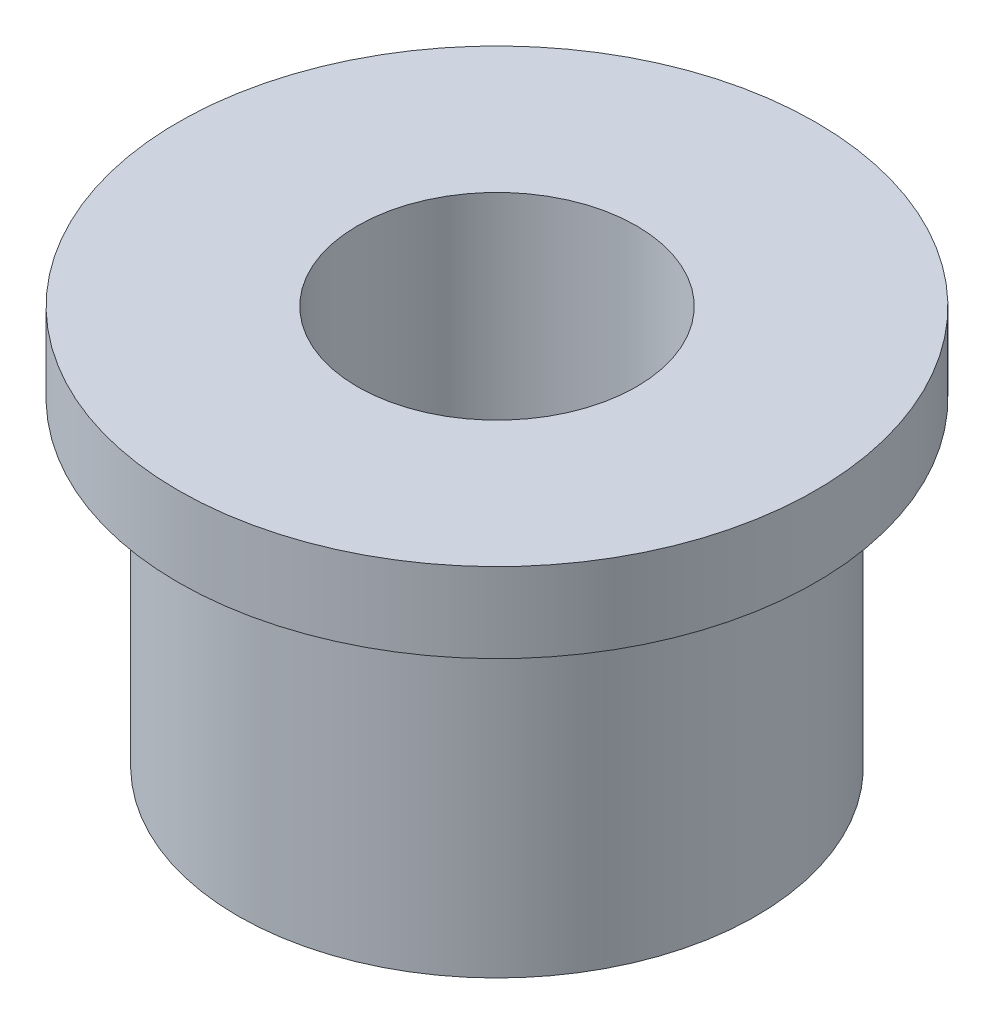
ISO-10303-21;
HEADER;
FILE_DESCRIPTION(('STEP AP214'),'2;1');
FILE_NAME('part.step','',(''),(''),'','','');
FILE_SCHEMA(('AUTOMOTIVE_DESIGN { 1 0 10303 214 1 1 1 1 }'));
ENDSEC;
DATA;
#1=APPLICATION_CONTEXT('core data for automotive mechanical design processes');
#2=APPLICATION_PROTOCOL_DEFINITION('international standard','automotive_design',2000,#1);
#3=PRODUCT_CONTEXT('',#1,'mechanical');
#4=PRODUCT('Part','Part','',(#3));
#5=PRODUCT_RELATED_PRODUCT_CATEGORY('part','',(#4));
#6=PRODUCT_DEFINITION_FORMATION('','',#4);
#7=PRODUCT_DEFINITION_CONTEXT('part definition',#1,'design');
#8=PRODUCT_DEFINITION('design','',#6,#7);
#9=PRODUCT_DEFINITION_SHAPE('','',#8);
#10=(LENGTH_UNIT() NAMED_UNIT(*) SI_UNIT(.MILLI.,.METRE.));
#11=(NAMED_UNIT(*) PLANE_ANGLE_UNIT() SI_UNIT($,.RADIAN.));
#12=(NAMED_UNIT(*) SI_UNIT($,.STERADIAN.) SOLID_ANGLE_UNIT());
#13=UNCERTAINTY_MEASURE_WITH_UNIT(LENGTH_MEASURE(1.E-05),#10,'distance_accuracy_value','');
#14=(GEOMETRIC_REPRESENTATION_CONTEXT(3) GLOBAL_UNCERTAINTY_ASSIGNED_CONTEXT((#13)) GLOBAL_UNIT_ASSIGNED_CONTEXT((#10,
#11,#12)) REPRESENTATION_CONTEXT('',''));
#15=CARTESIAN_POINT('',(0.,0.,0.));
#16=DIRECTION('',(0.,0.,1.));
#17=DIRECTION('',(1.,0.,0.));
#18=AXIS2_PLACEMENT_3D('',#15,#16,#17);
#19=CARTESIAN_POINT('',(0.,2.,0.));
#20=DIRECTION('',(0.,-1.,0.));
#21=DIRECTION('',(0.,0.,-1.));
#22=AXIS2_PLACEMENT_3D('',#19,#20,#21);
#23=CONICAL_SURFACE('',#22,3.5,0.982793723247329);
#24=CARTESIAN_POINT('',(0.,0.,0.));
#25=DIRECTION('',(0.,1.,0.));
#26=DIRECTION('',(0.,0.,1.));
#27=AXIS2_PLACEMENT_3D('',#24,#25,#26);
#28=CIRCLE('',#27,6.5);
#29=CARTESIAN_POINT('',(0.,0.,6.5));
#30=VERTEX_POINT('',#29);
#31=EDGE_CURVE('E12',#30,#30,#28,.T.);
#32=ORIENTED_EDGE('',*,*,#31,.F.);
#33=EDGE_LOOP('',(#32));
#34=FACE_BOUND('',#33,.T.);
#35=CARTESIAN_POINT('',(0.,2.,0.));
#36=DIRECTION('',(0.,1.,0.));
#37=DIRECTION('',(0.,0.,1.));
#38=AXIS2_PLACEMENT_3D('',#35,#36,#37);
#39=CIRCLE('',#38,3.5);
#40=CARTESIAN_POINT('',(0.,2.,3.5));
#41=VERTEX_POINT('',#40);
#42=EDGE_CURVE('E75',#41,#41,#39,.T.);
#43=ORIENTED_EDGE('',*,*,#42,.T.);
#44=EDGE_LOOP('',(#43));
#45=FACE_BOUND('',#44,.T.);
#46=ADVANCED_FACE('F46',(#34,#45),#23,.F.);
#47=CARTESIAN_POINT('',(0.,8.94796380090498,0.));
#48=DIRECTION('',(0.,1.,0.));
#49=DIRECTION('',(0.,0.,1.));
#50=AXIS2_PLACEMENT_3D('',#47,#48,#49);
#51=CYLINDRICAL_SURFACE('',#50,6.5);
#52=CARTESIAN_POINT('',(0.,8.,0.));
#53=DIRECTION('',(0.,1.,0.));
#54=DIRECTION('',(0.,0.,1.));
#55=AXIS2_PLACEMENT_3D('',#52,#53,#54);
#56=CIRCLE('',#55,6.5);
#57=CARTESIAN_POINT('',(0.,8.,6.5));
#58=VERTEX_POINT('',#57);
#59=EDGE_CURVE('E53',#58,#58,#56,.T.);
#60=ORIENTED_EDGE('',*,*,#59,.F.);
#61=EDGE_LOOP('',(#60));
#62=FACE_BOUND('',#61,.T.);
#63=ORIENTED_EDGE('',*,*,#31,.T.);
#64=EDGE_LOOP('',(#63));
#65=FACE_BOUND('',#64,.T.);
#66=ADVANCED_FACE('F102',(#62,#65),#51,.T.);
#67=CARTESIAN_POINT('',(6.5,8.,0.));
#68=DIRECTION('',(0.,1.,0.));
#69=DIRECTION('',(0.,0.,1.));
#70=AXIS2_PLACEMENT_3D('',#67,#68,#69);
#71=PLANE('',#70);
#72=CARTESIAN_POINT('',(0.,8.,0.));
#73=DIRECTION('',(0.,1.,0.));
#74=DIRECTION('',(0.,0.,1.));
#75=AXIS2_PLACEMENT_3D('',#72,#73,#74);
#76=CIRCLE('',#75,8.);
#77=CARTESIAN_POINT('',(0.,8.,8.));
#78=VERTEX_POINT('',#77);
#79=EDGE_CURVE('E59',#78,#78,#76,.T.);
#80=ORIENTED_EDGE('',*,*,#79,.F.);
#81=EDGE_LOOP('',(#80));
#82=FACE_BOUND('',#81,.T.);
#83=ORIENTED_EDGE('',*,*,#59,.T.);
#84=EDGE_LOOP('',(#83));
#85=FACE_BOUND('',#84,.T.);
#86=ADVANCED_FACE('F97',(#82,#85),#71,.F.);
#87=CARTESIAN_POINT('',(0.,8.94796380090498,0.));
#88=DIRECTION('',(0.,1.,0.));
#89=DIRECTION('',(0.,0.,1.));
#90=AXIS2_PLACEMENT_3D('',#87,#88,#89);
#91=CYLINDRICAL_SURFACE('',#90,8.);
#92=CARTESIAN_POINT('',(0.,10.,0.));
#93=DIRECTION('',(0.,1.,0.));
#94=DIRECTION('',(0.,0.,1.));
#95=AXIS2_PLACEMENT_3D('',#92,#93,#94);
#96=CIRCLE('',#95,8.);
#97=CARTESIAN_POINT('',(0.,10.,8.));
#98=VERTEX_POINT('',#97);
#99=EDGE_CURVE('E65',#98,#98,#96,.T.);
#100=ORIENTED_EDGE('',*,*,#99,.F.);
#101=EDGE_LOOP('',(#100));
#102=FACE_BOUND('',#101,.T.);
#103=ORIENTED_EDGE('',*,*,#79,.T.);
#104=EDGE_LOOP('',(#103));
#105=FACE_BOUND('',#104,.T.);
#106=ADVANCED_FACE('F91',(#102,#105),#91,.T.);
#107=CARTESIAN_POINT('',(8.,10.,0.));
#108=DIRECTION('',(0.,-1.,0.));
#109=DIRECTION('',(0.,0.,-1.));
#110=AXIS2_PLACEMENT_3D('',#107,#108,#109);
#111=PLANE('',#110);
#112=CARTESIAN_POINT('',(0.,10.,0.));
#113=DIRECTION('',(0.,1.,0.));
#114=DIRECTION('',(0.,0.,1.));
#115=AXIS2_PLACEMENT_3D('',#112,#113,#114);
#116=CIRCLE('',#115,3.5);
#117=CARTESIAN_POINT('',(0.,10.,3.5));
#118=VERTEX_POINT('',#117);
#119=EDGE_CURVE('E71',#118,#118,#116,.T.);
#120=ORIENTED_EDGE('',*,*,#119,.F.);
#121=EDGE_LOOP('',(#120));
#122=FACE_BOUND('',#121,.T.);
#123=ORIENTED_EDGE('',*,*,#99,.T.);
#124=EDGE_LOOP('',(#123));
#125=FACE_BOUND('',#124,.T.);
#126=ADVANCED_FACE('F85',(#122,#125),#111,.F.);
#127=CARTESIAN_POINT('',(0.,8.94796380090498,0.));
#128=DIRECTION('',(0.,1.,0.));
#129=DIRECTION('',(0.,0.,1.));
#130=AXIS2_PLACEMENT_3D('',#127,#128,#129);
#131=CYLINDRICAL_SURFACE('',#130,3.5);
#132=ORIENTED_EDGE('',*,*,#42,.F.);
#133=EDGE_LOOP('',(#132));
#134=FACE_BOUND('',#133,.T.);
#135=ORIENTED_EDGE('',*,*,#119,.T.);
#136=EDGE_LOOP('',(#135));
#137=FACE_BOUND('',#136,.T.);
#138=ADVANCED_FACE('F82',(#134,#137),#131,.F.);
#139=CLOSED_SHELL('',(#46,#66,#86,#106,#126,#138));
#140=MANIFOLD_SOLID_BREP('B2',#139);
#141=ADVANCED_BREP_SHAPE_REPRESENTATION('',(#18,#140),#14);
#142=SHAPE_DEFINITION_REPRESENTATION(#9,#141);
ENDSEC;
END-ISO-10303-21;
